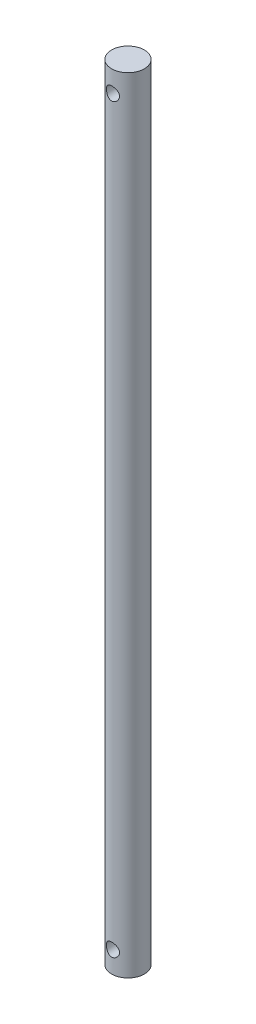
ISO-10303-21;
HEADER;
FILE_DESCRIPTION(('STEP AP214'),'2;1');
FILE_NAME('part.step','',(''),(''),'','','');
FILE_SCHEMA(('AUTOMOTIVE_DESIGN { 1 0 10303 214 1 1 1 1 }'));
ENDSEC;
DATA;
#1=APPLICATION_CONTEXT('core data for automotive mechanical design processes');
#2=APPLICATION_PROTOCOL_DEFINITION('international standard','automotive_design',2000,#1);
#3=PRODUCT_CONTEXT('',#1,'mechanical');
#4=PRODUCT('Part','Part','',(#3));
#5=PRODUCT_RELATED_PRODUCT_CATEGORY('part','',(#4));
#6=PRODUCT_DEFINITION_FORMATION('','',#4);
#7=PRODUCT_DEFINITION_CONTEXT('part definition',#1,'design');
#8=PRODUCT_DEFINITION('design','',#6,#7);
#9=PRODUCT_DEFINITION_SHAPE('','',#8);
#10=(LENGTH_UNIT() NAMED_UNIT(*) SI_UNIT(.MILLI.,.METRE.));
#11=(NAMED_UNIT(*) PLANE_ANGLE_UNIT() SI_UNIT($,.RADIAN.));
#12=(NAMED_UNIT(*) SI_UNIT($,.STERADIAN.) SOLID_ANGLE_UNIT());
#13=UNCERTAINTY_MEASURE_WITH_UNIT(LENGTH_MEASURE(1.E-05),#10,'distance_accuracy_value','');
#14=(GEOMETRIC_REPRESENTATION_CONTEXT(3) GLOBAL_UNCERTAINTY_ASSIGNED_CONTEXT((#13)) GLOBAL_UNIT_ASSIGNED_CONTEXT((#10,
#11,#12)) REPRESENTATION_CONTEXT('',''));
#15=CARTESIAN_POINT('',(0.,0.,0.));
#16=DIRECTION('',(0.,0.,1.));
#17=DIRECTION('',(1.,0.,0.));
#18=AXIS2_PLACEMENT_3D('',#15,#16,#17);
#19=CARTESIAN_POINT('',(0.,339.,0.));
#20=DIRECTION('',(0.,-1.,0.));
#21=DIRECTION('',(0.,0.,-1.));
#22=AXIS2_PLACEMENT_3D('',#19,#20,#21);
#23=CYLINDRICAL_SURFACE('',#22,5.);
#24=CARTESIAN_POINT('',(0.,0.,0.));
#25=DIRECTION('',(0.,1.,0.));
#26=DIRECTION('',(0.,0.,1.));
#27=AXIS2_PLACEMENT_3D('',#24,#25,#26);
#28=CIRCLE('',#27,5.);
#29=CARTESIAN_POINT('',(0.,0.,5.));
#30=VERTEX_POINT('',#29);
#31=EDGE_CURVE('E10',#30,#30,#28,.T.);
#32=ORIENTED_EDGE('',*,*,#31,.T.);
#33=EDGE_LOOP('',(#32));
#34=FACE_BOUND('',#33,.T.);
#35=CARTESIAN_POINT('',(0.,239.5,0.));
#36=DIRECTION('',(0.,1.,0.));
#37=DIRECTION('',(0.,0.,1.));
#38=AXIS2_PLACEMENT_3D('',#35,#36,#37);
#39=CIRCLE('',#38,5.);
#40=CARTESIAN_POINT('',(0.,239.5,5.));
#41=VERTEX_POINT('',#40);
#42=EDGE_CURVE('E58',#41,#41,#39,.T.);
#43=ORIENTED_EDGE('',*,*,#42,.F.);
#44=EDGE_LOOP('',(#43));
#45=FACE_BOUND('',#44,.T.);
#46=CARTESIAN_POINT('',(-2.,6.5,4.58257569495584));
#47=CARTESIAN_POINT('',(-1.99999540068022,6.39287631028704,4.58258022779737));
#48=CARTESIAN_POINT('',(-1.99134173553407,6.28557370566816,4.58638433797122));
#49=CARTESIAN_POINT('',(-1.95706710874823,6.07406091590043,4.601110833066));
#50=CARTESIAN_POINT('',(-1.93140279032341,5.96985934566148,4.61205140628347));
#51=CARTESIAN_POINT('',(-1.86423554476216,5.76794819102917,4.63960410719222));
#52=CARTESIAN_POINT('',(-1.82279228998551,5.67021575670878,4.65619484260882));
#53=CARTESIAN_POINT('',(-1.72542013194152,5.4831146451377,4.69314677188873));
#54=CARTESIAN_POINT('',(-1.66949439157707,5.39374414747589,4.71350714220611));
#55=CARTESIAN_POINT('',(-1.54132201423254,5.22073968545567,4.75700861562336));
#56=CARTESIAN_POINT('',(-1.46837936836551,5.13764360060276,4.78023917022606));
#57=CARTESIAN_POINT('',(-1.30970909513215,4.9844709791442,4.82612457915278));
#58=CARTESIAN_POINT('',(-1.22397701877347,4.9143989922903,4.84877922991761));
#59=CARTESIAN_POINT('',(-1.03800631337303,4.78659360969029,4.89203407641395));
#60=CARTESIAN_POINT('',(-0.937328966419093,4.72945570031406,4.9125180361257));
#61=CARTESIAN_POINT('',(-0.726825322068638,4.63315642982621,4.94803927702516));
#62=CARTESIAN_POINT('',(-0.617002769076882,4.59398775375113,4.96307877403249));
#63=CARTESIAN_POINT('',(-0.396966427039753,4.53665851400691,4.98538324990609));
#64=CARTESIAN_POINT('',(-0.287028984858316,4.51757268602978,4.99298936770628));
#65=CARTESIAN_POINT('',(-0.0652663285839612,4.49797151421855,5.00080310687431));
#66=CARTESIAN_POINT('',(0.0465581658394121,4.4974492440342,5.00101348770556));
#67=CARTESIAN_POINT('',(0.26223249470209,4.5144827698042,4.99421962820612));
#68=CARTESIAN_POINT('',(0.366177452870458,4.53102477275472,4.98761996771485));
#69=CARTESIAN_POINT('',(0.569673109221914,4.57999287630297,4.96849291469141));
#70=CARTESIAN_POINT('',(0.66922348439124,4.61242014239846,4.95596508721342));
#71=CARTESIAN_POINT('',(0.862897938510559,4.69263648287826,4.92596824457467));
#72=CARTESIAN_POINT('',(0.956917623378897,4.74064971481538,4.90842760466223));
#73=CARTESIAN_POINT('',(1.13580815074131,4.85046500691916,4.87014585180275));
#74=CARTESIAN_POINT('',(1.22067584271796,4.91227179310017,4.84940364267149));
#75=CARTESIAN_POINT('',(1.38476882799018,5.05264913594388,4.80521637176122));
#76=CARTESIAN_POINT('',(1.46325784526632,5.1320538925728,4.78168326511759));
#77=CARTESIAN_POINT('',(1.60610741539265,5.302990571832,4.73561660973263));
#78=CARTESIAN_POINT('',(1.67046334378698,5.39452644819561,4.71308339008076));
#79=CARTESIAN_POINT('',(1.78490418871927,5.59041902237394,4.67096897409023));
#80=CARTESIAN_POINT('',(1.83453465163626,5.69506483033865,4.65148914057708));
#81=CARTESIAN_POINT('',(1.91517625986646,5.91221549031222,4.61887590344084));
#82=CARTESIAN_POINT('',(1.94619949837798,6.02471518472659,4.60573837891311));
#83=CARTESIAN_POINT('',(1.9869549488549,6.24703577746744,4.58829759702716));
#84=CARTESIAN_POINT('',(1.99787209681454,6.35660044712856,4.58350366456138));
#85=CARTESIAN_POINT('',(2.00156132644289,6.57607720775956,4.58189497869038));
#86=CARTESIAN_POINT('',(1.99433891059128,6.68598918327566,4.58507780560362));
#87=CARTESIAN_POINT('',(1.96303289479003,6.89645893495694,4.59856044359114));
#88=CARTESIAN_POINT('',(1.93993306202386,6.99719293740006,4.60844457798301));
#89=CARTESIAN_POINT('',(1.87880418691087,7.19328840478545,4.6337005102734));
#90=CARTESIAN_POINT('',(1.84077183430228,7.28864867310715,4.64907352488598));
#91=CARTESIAN_POINT('',(1.74913563948157,7.47560235779566,4.68433781860101));
#92=CARTESIAN_POINT('',(1.69496286826465,7.56688618869453,4.70438704639177));
#93=CARTESIAN_POINT('',(1.57316522444182,7.73948298744159,4.74650385157795));
#94=CARTESIAN_POINT('',(1.50553487348189,7.82079187279545,4.76857224896045));
#95=CARTESIAN_POINT('',(1.35284421168058,7.97737340859937,4.81420915971416));
#96=CARTESIAN_POINT('',(1.26686542944543,8.0517565652916,4.83776807285233));
#97=CARTESIAN_POINT('',(1.0830836333685,8.18517707660977,4.88219794567532));
#98=CARTESIAN_POINT('',(0.985280138466608,8.24421380659512,4.90306879593136));
#99=CARTESIAN_POINT('',(0.780279934003014,8.34504762646334,4.9398371590039));
#100=CARTESIAN_POINT('',(0.673085480998744,8.38684884417366,4.9557358624066));
#101=CARTESIAN_POINT('',(0.452393590914547,8.45154885239976,4.98072713468904));
#102=CARTESIAN_POINT('',(0.338899610276818,8.47445790141069,4.98982339706103));
#103=CARTESIAN_POINT('',(0.116816510362613,8.49950470165284,4.99979008211858));
#104=CARTESIAN_POINT('',(0.00839049265208496,8.50290012856203,5.00115846749745));
#105=CARTESIAN_POINT('',(-0.207433835792267,8.49214452061653,4.99686042373721));
#106=CARTESIAN_POINT('',(-0.314832299614388,8.47799614184442,4.99119505948774));
#107=CARTESIAN_POINT('',(-0.522170901733398,8.43345321200012,4.97371513381836));
#108=CARTESIAN_POINT('',(-0.622238803864868,8.40357105524344,4.96209480698998));
#109=CARTESIAN_POINT('',(-0.815922355542603,8.32894719411893,4.93394947767358));
#110=CARTESIAN_POINT('',(-0.909536811189122,8.28420274906091,4.91742357062859));
#111=CARTESIAN_POINT('',(-1.09220303880515,8.17889680664677,4.88018094611867));
#112=CARTESIAN_POINT('',(-1.18087037518738,8.11772372467487,4.859311306872));
#113=CARTESIAN_POINT('',(-1.34705404014793,7.98221146125301,4.8158940222708));
#114=CARTESIAN_POINT('',(-1.42456572919735,7.90786683039178,4.79334568464253));
#115=CARTESIAN_POINT('',(-1.57120121894449,7.74268485315134,4.7473776736768));
#116=CARTESIAN_POINT('',(-1.63950871002775,7.6511114248559,4.72399047228096));
#117=CARTESIAN_POINT('',(-1.75984762763149,7.45705756427917,4.68049656850749));
#118=CARTESIAN_POINT('',(-1.81187714055767,7.35457585154645,4.66039025195448));
#119=CARTESIAN_POINT('',(-1.89399048451634,7.1509638135298,4.62758914239063));
#120=CARTESIAN_POINT('',(-1.92562535665267,7.05053839728756,4.61439096680415));
#121=CARTESIAN_POINT('',(-1.97271990928489,6.84551095850736,4.5944582603412));
#122=CARTESIAN_POINT('',(-1.98822466191608,6.74092142657564,4.58770572290435));
#123=CARTESIAN_POINT('',(-1.99692202185513,6.61322176088848,4.5839176394209));
#124=CARTESIAN_POINT('',(-1.99807530751895,6.59059851964357,4.58341531117284));
#125=CARTESIAN_POINT('',(-1.9996148112425,6.54531952320278,4.58274384722723));
#126=CARTESIAN_POINT('',(-2.0000009730612,6.52266376574484,4.5825747359592));
#127=CARTESIAN_POINT('',(-2.,6.5,4.58257569495584));
#128=B_SPLINE_CURVE_WITH_KNOTS('',3,(#46,#47,#48,#49,#50,#51,#52,#53,#54,#55,#56,#57,#58,#59,
#60,#61,#62,#63,#64,#65,#66,#67,#68,#69,#70,#71,#72,#73,#74,#75,#76,#77,#78,#79,#80,#81,#82,#83,
#84,#85,#86,#87,#88,#89,#90,#91,#92,#93,#94,#95,#96,#97,#98,#99,#100,#101,#102,#103,#104,#105,
#106,#107,#108,#109,#110,#111,#112,#113,#114,#115,#116,#117,#118,#119,#120,#121,#122,#123,#124,
#125,#126,#127),.UNSPECIFIED.,.T.,.F.,(4,2,2,2,2,2,2,2,2,2,2,2,2,2,2,2,2,2,2,2,2,2,2,2,2,2,2,2,
2,2,2,2,2,2,2,2,2,2,2,2,4),(0.,0.321277648767654,0.643377335822245,0.96427082329339,
1.28509428823861,1.62255618284425,1.96013574348342,2.31102669091428,2.6617746696948,
2.99554182887183,3.32918445305672,3.64408644830302,3.95901155129059,4.27868300234898,
4.59846414940031,4.93924044081356,5.28012807127127,5.63064458717257,5.98093304800101,
6.3098214752442,6.63861014907939,6.94867248085145,7.25880358651638,7.58151154652701,
7.90435114525849,8.25103734246979,8.59773764852748,8.94435487312812,9.29078375954136,
9.61461039755953,9.93838801512601,10.2522199444335,10.5661097782858,10.8938705113992,
11.2217671656421,11.5699625328561,11.9181988175919,12.2351666081908,12.5512463021924,
12.619212852096,12.6871843847255),.UNSPECIFIED.);
#129=CARTESIAN_POINT('',(-2.,6.5,4.58257569495584));
#130=VERTEX_POINT('',#129);
#131=EDGE_CURVE('E67',#130,#130,#128,.T.);
#132=ORIENTED_EDGE('',*,*,#131,.F.);
#133=EDGE_LOOP('',(#132));
#134=FACE_BOUND('',#133,.T.);
#135=CARTESIAN_POINT('',(0.,8.50000000000001,-5.));
#136=CARTESIAN_POINT('',(0.107493005442891,8.49999014817629,-4.99999271227085));
#137=CARTESIAN_POINT('',(0.215172564090672,8.49128224791163,-4.99649294306933));
#138=CARTESIAN_POINT('',(0.427496480417894,8.45675229647876,-4.98283453100642));
#139=CARTESIAN_POINT('',(0.532131777561247,8.43088372091387,-4.97265778698877));
#140=CARTESIAN_POINT('',(0.734953922727403,8.36312392194117,-4.94674209213118));
#141=CARTESIAN_POINT('',(0.83316066161696,8.32128515378327,-4.93102136364072));
#142=CARTESIAN_POINT('',(1.02107197032837,8.22298082667345,-4.89556610796078));
#143=CARTESIAN_POINT('',(1.11077947675099,8.16652034508107,-4.87583297458057));
#144=CARTESIAN_POINT('',(1.28350100757039,8.03776450143906,-4.83330886170419));
#145=CARTESIAN_POINT('',(1.36606227255021,7.96489334375973,-4.8104229692919));
#146=CARTESIAN_POINT('',(1.51817500478472,7.80659999652322,-4.76460576906194));
#147=CARTESIAN_POINT('',(1.58772010713353,7.72117170278826,-4.74167444453792));
#148=CARTESIAN_POINT('',(1.71487456729288,7.53557192975773,-4.69722791797136));
#149=CARTESIAN_POINT('',(1.77181498119547,7.4349135139768,-4.67582115964951));
#150=CARTESIAN_POINT('',(1.86775471903715,7.22446360157996,-4.63833647186793));
#151=CARTESIAN_POINT('',(1.90676256428583,7.11467647215164,-4.62225601244176));
#152=CARTESIAN_POINT('',(1.96389882339587,6.8942876664079,-4.59826357660818));
#153=CARTESIAN_POINT('',(1.98289396580565,6.78394876442379,-4.59001420355605));
#154=CARTESIAN_POINT('',(2.00217296164003,6.56136500169273,-4.58164004049144));
#155=CARTESIAN_POINT('',(2.00246601631322,6.44912110537499,-4.58151125522768));
#156=CARTESIAN_POINT('',(1.98498936750454,6.23424332854196,-4.58910500279994));
#157=CARTESIAN_POINT('',(1.96847531430514,6.13148428559097,-4.5962817503845));
#158=CARTESIAN_POINT('',(1.91994688029782,5.93034044399329,-4.61676187607836));
#159=CARTESIAN_POINT('',(1.88792979480463,5.83195641188969,-4.63006632321673));
#160=CARTESIAN_POINT('',(1.80869473255107,5.63998216380396,-4.6615948508853));
#161=CARTESIAN_POINT('',(1.76117986231532,5.54653076094531,-4.67991379280788));
#162=CARTESIAN_POINT('',(1.65250646073221,5.36858418363844,-4.7193811638989));
#163=CARTESIAN_POINT('',(1.59134280510084,5.28409239059719,-4.74053065456848));
#164=CARTESIAN_POINT('',(1.45155059945443,5.119590271198,-4.78526736742271));
#165=CARTESIAN_POINT('',(1.37193746297063,5.04043127055398,-4.80891664976152));
#166=CARTESIAN_POINT('',(1.20031442743019,4.89631552199796,-4.85459824958282));
#167=CARTESIAN_POINT('',(1.10830206533443,4.83136160258971,-4.87663024445325));
#168=CARTESIAN_POINT('',(0.912077652605843,4.71638255258417,-4.91714681264548));
#169=CARTESIAN_POINT('',(0.807660491346477,4.66667771880295,-4.93555270095415));
#170=CARTESIAN_POINT('',(0.591023765482882,4.58583213892194,-4.96614828328759));
#171=CARTESIAN_POINT('',(0.478808196849674,4.55468196244259,-4.97834113462382));
#172=CARTESIAN_POINT('',(0.25689588760782,4.5135517045803,-4.99456139506911));
#173=CARTESIAN_POINT('',(0.147443293985534,4.50242754574644,-4.99902945833514));
#174=CARTESIAN_POINT('',(-0.0718453098078174,4.49828689947139,-5.00068478510631));
#175=CARTESIAN_POINT('',(-0.181681213223924,4.50526571845249,-4.99787393582291));
#176=CARTESIAN_POINT('',(-0.393432739121988,4.53629175255199,-4.98557567063753));
#177=CARTESIAN_POINT('',(-0.495482491775474,4.55955798035098,-4.97639391345523));
#178=CARTESIAN_POINT('',(-0.69413542806078,4.62143570830981,-4.952594414055));
#179=CARTESIAN_POINT('',(-0.790737910224845,4.66004917966868,-4.9379759735653));
#180=CARTESIAN_POINT('',(-0.979078785816702,4.75278493967995,-4.90416594770812));
#181=CARTESIAN_POINT('',(-1.07057802275541,4.80734547204315,-4.88484815979804));
#182=CARTESIAN_POINT('',(-1.24344359124656,4.92994032390564,-4.84373364745525));
#183=CARTESIAN_POINT('',(-1.32480584076113,4.99798004292261,-4.8219359311027));
#184=CARTESIAN_POINT('',(-1.48072304302882,5.15087001294963,-4.77645117638112));
#185=CARTESIAN_POINT('',(-1.55447393380606,5.23653354150621,-4.75273441425052));
#186=CARTESIAN_POINT('',(-1.68675119741371,5.41944008300937,-4.70741672917132));
#187=CARTESIAN_POINT('',(-1.74527506133751,5.51668500033995,-4.68581615526511));
#188=CARTESIAN_POINT('',(-1.84580750193163,5.72146169459411,-4.64714299907709));
#189=CARTESIAN_POINT('',(-1.88765059453445,5.82908399921231,-4.63011630884788));
#190=CARTESIAN_POINT('',(-1.9522962197053,6.05073365171516,-4.60323673477932));
#191=CARTESIAN_POINT('',(-1.97511280526932,6.16475620581243,-4.59337855695998));
#192=CARTESIAN_POINT('',(-1.9997156172784,6.38712790177454,-4.58271759299926));
#193=CARTESIAN_POINT('',(-2.00289708230287,6.49529483959335,-4.58131421008171));
#194=CARTESIAN_POINT('',(-1.99180315927752,6.71054485771329,-4.58614836033098));
#195=CARTESIAN_POINT('',(-1.97752998791378,6.81762807390258,-4.59238492324793));
#196=CARTESIAN_POINT('',(-1.93307136615365,7.02333218985504,-4.61126649079021));
#197=CARTESIAN_POINT('',(-1.90353749357098,7.122120274433,-4.62364831827449));
#198=CARTESIAN_POINT('',(-1.83000544849101,7.31337862961348,-4.65324001232697));
#199=CARTESIAN_POINT('',(-1.78600328139381,7.40584714689983,-4.67045121206007));
#200=CARTESIAN_POINT('',(-1.68187276275973,7.58760961927078,-4.70898609604491));
#201=CARTESIAN_POINT('',(-1.62096533515949,7.67641867013048,-4.73048882313242));
#202=CARTESIAN_POINT('',(-1.48589211927149,7.84299331720376,-4.77463804372237));
#203=CARTESIAN_POINT('',(-1.41172233481812,7.92075557212832,-4.79728488048406));
#204=CARTESIAN_POINT('',(-1.24650550627246,8.06820285326361,-4.84293567087394));
#205=CARTESIAN_POINT('',(-1.15467600114614,8.13703730689807,-4.86586757962185));
#206=CARTESIAN_POINT('',(-0.959900320285779,8.25833704262164,-4.90800406713717));
#207=CARTESIAN_POINT('',(-0.856949004547237,8.31079471215253,-4.92720691092906));
#208=CARTESIAN_POINT('',(-0.644738062495202,8.39662221519029,-4.95939714815861));
#209=CARTESIAN_POINT('',(-0.535631618219695,8.43032932356034,-4.97249363055028));
#210=CARTESIAN_POINT('',(-0.31287654628122,8.47863912095426,-4.99144306209366));
#211=CARTESIAN_POINT('',(-0.199243525858911,8.49330243674389,-4.99731899495638));
#212=CARTESIAN_POINT('',(-0.0569122978909286,8.49939538097827,-4.99975899504136));
#213=CARTESIAN_POINT('',(-0.0284626887407579,8.5000026086292,-5.00000192969176));
#214=CARTESIAN_POINT('',(0.,8.50000000000001,-5.));
#215=B_SPLINE_CURVE_WITH_KNOTS('',3,(#135,#136,#137,#138,#139,#140,#141,#142,#143,#144,#145,
#146,#147,#148,#149,#150,#151,#152,#153,#154,#155,#156,#157,#158,#159,#160,#161,#162,#163,#164,
#165,#166,#167,#168,#169,#170,#171,#172,#173,#174,#175,#176,#177,#178,#179,#180,#181,#182,#183,
#184,#185,#186,#187,#188,#189,#190,#191,#192,#193,#194,#195,#196,#197,#198,#199,#200,#201,#202,
#203,#204,#205,#206,#207,#208,#209,#210,#211,#212,#213,#214),.UNSPECIFIED.,.T.,.F.,(4,2,2,2,2,2,
2,2,2,2,2,2,2,2,2,2,2,2,2,2,2,2,2,2,2,2,2,2,2,2,2,2,2,2,2,2,2,2,2,4),(0.,0.322402987893069,
0.645683636007935,0.967911457471583,1.29002753567984,1.62597381700397,1.96208394934411,
2.31315258819217,2.66405423118268,2.99904105308829,3.33386306340488,3.64538328401372,
3.95695787256047,4.27489126298816,4.59294421938183,4.93558349186557,5.27829092839733,
5.62776913162806,5.9770695611379,6.30569184528007,6.63422893570082,6.94800455564365,
7.26182048993796,7.58523513398263,7.90877959498969,8.25368474624414,8.59864669043748,
8.94695045140828,9.29499672645934,9.61799673392748,9.94095572563046,10.2511431854877,
10.5614163580516,10.8894546805669,11.2175920134839,11.5670042353384,11.9165786364053,
12.2596430101332,12.6016125240434,12.686980458968),.UNSPECIFIED.);
#216=CARTESIAN_POINT('',(0.,8.50000000000001,-5.));
#217=VERTEX_POINT('',#216);
#218=EDGE_CURVE('E64',#217,#217,#215,.T.);
#219=ORIENTED_EDGE('',*,*,#218,.F.);
#220=EDGE_LOOP('',(#219));
#221=FACE_BOUND('',#220,.T.);
#222=CARTESIAN_POINT('',(-2.,233.,4.58257569495584));
#223=CARTESIAN_POINT('',(-1.99999540068022,232.892876310287,4.58258022779737));
#224=CARTESIAN_POINT('',(-1.99134173553407,232.785573705668,4.58638433797122));
#225=CARTESIAN_POINT('',(-1.95706710874823,232.5740609159,4.601110833066));
#226=CARTESIAN_POINT('',(-1.9314027903234,232.469859345662,4.61205140628347));
#227=CARTESIAN_POINT('',(-1.86423554476216,232.267948191029,4.63960410719222));
#228=CARTESIAN_POINT('',(-1.82279228998552,232.170215756709,4.65619484260882));
#229=CARTESIAN_POINT('',(-1.72542013194153,231.983114645138,4.69314677188873));
#230=CARTESIAN_POINT('',(-1.66949439157708,231.893744147476,4.71350714220611));
#231=CARTESIAN_POINT('',(-1.54132201423256,231.720739685456,4.75700861562335));
#232=CARTESIAN_POINT('',(-1.46837936836554,231.637643600603,4.78023917022605));
#233=CARTESIAN_POINT('',(-1.30970909513219,231.484470979144,4.82612457915276));
#234=CARTESIAN_POINT('',(-1.2239770187735,231.41439899229,4.84877922991761));
#235=CARTESIAN_POINT('',(-1.03800631337305,231.28659360969,4.89203407641394));
#236=CARTESIAN_POINT('',(-0.937328966419111,231.229455700314,4.9125180361257));
#237=CARTESIAN_POINT('',(-0.72682532206865,231.133156429826,4.94803927702516));
#238=CARTESIAN_POINT('',(-0.617002769076889,231.093987753751,4.96307877403249));
#239=CARTESIAN_POINT('',(-0.396966427039751,231.036658514007,4.98538324990609));
#240=CARTESIAN_POINT('',(-0.287028984858313,231.01757268603,4.99298936770628));
#241=CARTESIAN_POINT('',(-0.06526632858396,230.997971514219,5.00080310687431));
#242=CARTESIAN_POINT('',(0.0465581658394105,230.997449244034,5.00101348770556));
#243=CARTESIAN_POINT('',(0.262232494702089,231.014482769804,4.99421962820612));
#244=CARTESIAN_POINT('',(0.36617745287046,231.031024772755,4.98761996771485));
#245=CARTESIAN_POINT('',(0.569673109221916,231.079992876303,4.96849291469141));
#246=CARTESIAN_POINT('',(0.669223484391237,231.112420142399,4.95596508721342));
#247=CARTESIAN_POINT('',(0.862897938510562,231.192636482878,4.92596824457467));
#248=CARTESIAN_POINT('',(0.956917623378909,231.240649714815,4.90842760466223));
#249=CARTESIAN_POINT('',(1.13580815074132,231.350465006919,4.87014585180274));
#250=CARTESIAN_POINT('',(1.22067584271797,231.4122717931,4.84940364267149));
#251=CARTESIAN_POINT('',(1.38476882799018,231.552649135944,4.80521637176122));
#252=CARTESIAN_POINT('',(1.46325784526633,231.632053892573,4.78168326511758));
#253=CARTESIAN_POINT('',(1.60610741539267,231.802990571832,4.73561660973262));
#254=CARTESIAN_POINT('',(1.67046334378699,231.894526448196,4.71308339008076));
#255=CARTESIAN_POINT('',(1.78490418871927,232.090419022374,4.67096897409023));
#256=CARTESIAN_POINT('',(1.83453465163626,232.195064830339,4.65148914057708));
#257=CARTESIAN_POINT('',(1.91517625986646,232.412215490312,4.61887590344084));
#258=CARTESIAN_POINT('',(1.94619949837799,232.524715184727,4.60573837891311));
#259=CARTESIAN_POINT('',(1.9869549488549,232.747035777467,4.58829759702716));
#260=CARTESIAN_POINT('',(1.99787209681454,232.856600447129,4.58350366456138));
#261=CARTESIAN_POINT('',(2.00156132644289,233.07607720776,4.58189497869038));
#262=CARTESIAN_POINT('',(1.99433891059129,233.185989183276,4.58507780560362));
#263=CARTESIAN_POINT('',(1.96303289479003,233.396458934957,4.59856044359114));
#264=CARTESIAN_POINT('',(1.93993306202386,233.4971929374,4.60844457798302));
#265=CARTESIAN_POINT('',(1.87880418691086,233.693288404786,4.6337005102734));
#266=CARTESIAN_POINT('',(1.84077183430227,233.788648673107,4.64907352488598));
#267=CARTESIAN_POINT('',(1.74913563948157,233.975602357796,4.68433781860102));
#268=CARTESIAN_POINT('',(1.69496286826464,234.066886188695,4.70438704639177));
#269=CARTESIAN_POINT('',(1.57316522444182,234.239482987442,4.74650385157795));
#270=CARTESIAN_POINT('',(1.50553487348189,234.320791872795,4.76857224896045));
#271=CARTESIAN_POINT('',(1.35284421168058,234.477373408599,4.81420915971416));
#272=CARTESIAN_POINT('',(1.26686542944545,234.551756565292,4.83776807285233));
#273=CARTESIAN_POINT('',(1.08308363336852,234.68517707661,4.88219794567532));
#274=CARTESIAN_POINT('',(0.98528013846662,234.744213806595,4.90306879593135));
#275=CARTESIAN_POINT('',(0.780279934003017,234.845047626463,4.9398371590039));
#276=CARTESIAN_POINT('',(0.673085480998743,234.886848844174,4.9557358624066));
#277=CARTESIAN_POINT('',(0.452393590914542,234.9515488524,4.98072713468904));
#278=CARTESIAN_POINT('',(0.338899610276814,234.974457901411,4.98982339706103));
#279=CARTESIAN_POINT('',(0.116816510362611,234.999504701653,4.99979008211858));
#280=CARTESIAN_POINT('',(0.00839049265208351,235.002900128562,5.00115846749745));
#281=CARTESIAN_POINT('',(-0.207433835792269,234.992144520617,4.99686042373721));
#282=CARTESIAN_POINT('',(-0.314832299614391,234.977996141844,4.99119505948774));
#283=CARTESIAN_POINT('',(-0.522170901733402,234.933453212,4.97371513381836));
#284=CARTESIAN_POINT('',(-0.622238803864873,234.903571055243,4.96209480698998));
#285=CARTESIAN_POINT('',(-0.815922355542607,234.828947194119,4.93394947767358));
#286=CARTESIAN_POINT('',(-0.909536811189125,234.784202749061,4.91742357062859));
#287=CARTESIAN_POINT('',(-1.09220303880515,234.678896806647,4.88018094611867));
#288=CARTESIAN_POINT('',(-1.18087037518738,234.617723724675,4.859311306872));
#289=CARTESIAN_POINT('',(-1.34705404014792,234.482211461253,4.8158940222708));
#290=CARTESIAN_POINT('',(-1.42456572919734,234.407866830392,4.79334568464253));
#291=CARTESIAN_POINT('',(-1.57120121894448,234.242684853151,4.7473776736768));
#292=CARTESIAN_POINT('',(-1.63950871002774,234.151111424856,4.72399047228096));
#293=CARTESIAN_POINT('',(-1.75984762763149,233.957057564279,4.6804965685075));
#294=CARTESIAN_POINT('',(-1.81187714055767,233.854575851547,4.66039025195448));
#295=CARTESIAN_POINT('',(-1.89399048451633,233.65096381353,4.62758914239064));
#296=CARTESIAN_POINT('',(-1.92562535665266,233.550538397288,4.61439096680415));
#297=CARTESIAN_POINT('',(-1.97271990928489,233.345510958507,4.5944582603412));
#298=CARTESIAN_POINT('',(-1.98822466191607,233.240921426576,4.58770572290435));
#299=CARTESIAN_POINT('',(-1.99692202185513,233.113221760889,4.5839176394209));
#300=CARTESIAN_POINT('',(-1.99807530751895,233.090598519644,4.58341531117284));
#301=CARTESIAN_POINT('',(-1.9996148112425,233.045319523203,4.58274384722723));
#302=CARTESIAN_POINT('',(-2.0000009730612,233.022663765745,4.5825747359592));
#303=CARTESIAN_POINT('',(-2.,233.,4.58257569495584));
#304=B_SPLINE_CURVE_WITH_KNOTS('',3,(#222,#223,#224,#225,#226,#227,#228,#229,#230,#231,#232,
#233,#234,#235,#236,#237,#238,#239,#240,#241,#242,#243,#244,#245,#246,#247,#248,#249,#250,#251,
#252,#253,#254,#255,#256,#257,#258,#259,#260,#261,#262,#263,#264,#265,#266,#267,#268,#269,#270,
#271,#272,#273,#274,#275,#276,#277,#278,#279,#280,#281,#282,#283,#284,#285,#286,#287,#288,#289,
#290,#291,#292,#293,#294,#295,#296,#297,#298,#299,#300,#301,#302,#303),.UNSPECIFIED.,.T.,.F.,(4,
2,2,2,2,2,2,2,2,2,2,2,2,2,2,2,2,2,2,2,2,2,2,2,2,2,2,2,2,2,2,2,2,2,2,2,2,2,2,2,4),(0.,
0.321277648767675,0.643377335822242,0.964270823293383,1.28509428823857,1.62255618284419,
1.96013574348339,2.31102669091426,2.66177466969481,2.99554182887184,3.32918445305672,
3.64408644830302,3.9590115512906,4.27868300234899,4.59846414940032,4.93924044081357,
5.28012807127129,5.63064458717255,5.98093304800102,6.30982147524419,6.63861014907939,
6.94867248085145,7.25880358651642,7.58151154652703,7.90435114525848,8.25103734246979,
8.59773764852747,8.94435487312813,9.29078375954137,9.61461039755953,9.93838801512602,
10.2522199444335,10.5661097782859,10.8938705113992,11.2217671656421,11.5699625328561,
11.9181988175919,12.2351666081907,12.5512463021924,12.619212852096,12.6871843847255),.UNSPECIFIED.);
#305=CARTESIAN_POINT('',(-2.,233.,4.58257569495584));
#306=VERTEX_POINT('',#305);
#307=EDGE_CURVE('E109',#306,#306,#304,.T.);
#308=ORIENTED_EDGE('',*,*,#307,.F.);
#309=EDGE_LOOP('',(#308));
#310=FACE_BOUND('',#309,.T.);
#311=CARTESIAN_POINT('',(0.,235.,-5.));
#312=CARTESIAN_POINT('',(0.107493005442892,234.999990148176,-4.99999271227084));
#313=CARTESIAN_POINT('',(0.215172564090676,234.991282247912,-4.99649294306933));
#314=CARTESIAN_POINT('',(0.427496480417898,234.956752296479,-4.98283453100642));
#315=CARTESIAN_POINT('',(0.532131777561248,234.930883720914,-4.97265778698877));
#316=CARTESIAN_POINT('',(0.734953922727405,234.863123921941,-4.94674209213118));
#317=CARTESIAN_POINT('',(0.833160661616964,234.821285153783,-4.93102136364072));
#318=CARTESIAN_POINT('',(1.02107197032837,234.722980826674,-4.89556610796078));
#319=CARTESIAN_POINT('',(1.11077947675099,234.666520345081,-4.87583297458057));
#320=CARTESIAN_POINT('',(1.28350100757039,234.537764501439,-4.83330886170419));
#321=CARTESIAN_POINT('',(1.36606227255021,234.46489334376,-4.81042296929191));
#322=CARTESIAN_POINT('',(1.51817500478472,234.306599996523,-4.76460576906195));
#323=CARTESIAN_POINT('',(1.58772010713353,234.221171702788,-4.74167444453792));
#324=CARTESIAN_POINT('',(1.71487456729288,234.035571929758,-4.69722791797136));
#325=CARTESIAN_POINT('',(1.77181498119547,233.934913513977,-4.67582115964951));
#326=CARTESIAN_POINT('',(1.86775471903715,233.72446360158,-4.63833647186793));
#327=CARTESIAN_POINT('',(1.90676256428584,233.614676472152,-4.62225601244176));
#328=CARTESIAN_POINT('',(1.96389882339587,233.394287666408,-4.59826357660818));
#329=CARTESIAN_POINT('',(1.98289396580565,233.283948764424,-4.59001420355605));
#330=CARTESIAN_POINT('',(2.00217296164003,233.061365001693,-4.58164004049144));
#331=CARTESIAN_POINT('',(2.00246601631322,232.949121105375,-4.58151125522768));
#332=CARTESIAN_POINT('',(1.98498936750455,232.734243328542,-4.58910500279994));
#333=CARTESIAN_POINT('',(1.96847531430514,232.631484285591,-4.5962817503845));
#334=CARTESIAN_POINT('',(1.91994688029783,232.430340443993,-4.61676187607836));
#335=CARTESIAN_POINT('',(1.88792979480464,232.33195641189,-4.63006632321672));
#336=CARTESIAN_POINT('',(1.80869473255108,232.139982163804,-4.6615948508853));
#337=CARTESIAN_POINT('',(1.76117986231532,232.046530760945,-4.67991379280787));
#338=CARTESIAN_POINT('',(1.65250646073222,231.868584183638,-4.7193811638989));
#339=CARTESIAN_POINT('',(1.59134280510085,231.784092390597,-4.74053065456848));
#340=CARTESIAN_POINT('',(1.45155059945445,231.619590271198,-4.7852673674227));
#341=CARTESIAN_POINT('',(1.37193746297066,231.540431270554,-4.80891664976151));
#342=CARTESIAN_POINT('',(1.20031442743022,231.396315521998,-4.85459824958281));
#343=CARTESIAN_POINT('',(1.10830206533446,231.33136160259,-4.87663024445324));
#344=CARTESIAN_POINT('',(0.912077652605859,231.216382552584,-4.91714681264548));
#345=CARTESIAN_POINT('',(0.807660491346491,231.166677718803,-4.93555270095414));
#346=CARTESIAN_POINT('',(0.59102376548289,231.085832138922,-4.96614828328759));
#347=CARTESIAN_POINT('',(0.478808196849679,231.054681962443,-4.97834113462382));
#348=CARTESIAN_POINT('',(0.256895887607823,231.01355170458,-4.99456139506911));
#349=CARTESIAN_POINT('',(0.147443293985537,231.002427545746,-4.99902945833514));
#350=CARTESIAN_POINT('',(-0.071845309807814,230.998286899471,-5.00068478510631));
#351=CARTESIAN_POINT('',(-0.18168121322392,231.005265718453,-4.99787393582292));
#352=CARTESIAN_POINT('',(-0.393432739121985,231.036291752552,-4.98557567063753));
#353=CARTESIAN_POINT('',(-0.495482491775472,231.059557980351,-4.97639391345523));
#354=CARTESIAN_POINT('',(-0.694135428060779,231.12143570831,-4.952594414055));
#355=CARTESIAN_POINT('',(-0.790737910224843,231.160049179669,-4.9379759735653));
#356=CARTESIAN_POINT('',(-0.979078785816698,231.25278493968,-4.90416594770812));
#357=CARTESIAN_POINT('',(-1.0705780227554,231.307345472043,-4.88484815979804));
#358=CARTESIAN_POINT('',(-1.24344359124655,231.429940323906,-4.84373364745525));
#359=CARTESIAN_POINT('',(-1.32480584076113,231.497980042923,-4.8219359311027));
#360=CARTESIAN_POINT('',(-1.48072304302883,231.65087001295,-4.77645117638111));
#361=CARTESIAN_POINT('',(-1.55447393380608,231.736533541506,-4.75273441425051));
#362=CARTESIAN_POINT('',(-1.68675119741372,231.919440083009,-4.70741672917132));
#363=CARTESIAN_POINT('',(-1.74527506133752,232.01668500034,-4.68581615526511));
#364=CARTESIAN_POINT('',(-1.84580750193163,232.221461694594,-4.64714299907708));
#365=CARTESIAN_POINT('',(-1.88765059453446,232.329083999212,-4.63011630884788));
#366=CARTESIAN_POINT('',(-1.95229621970531,232.550733651715,-4.60323673477931));
#367=CARTESIAN_POINT('',(-1.97511280526931,232.664756205812,-4.59337855695998));
#368=CARTESIAN_POINT('',(-1.9997156172784,232.887127901775,-4.58271759299926));
#369=CARTESIAN_POINT('',(-2.00289708230287,232.995294839593,-4.58131421008171));
#370=CARTESIAN_POINT('',(-1.99180315927752,233.210544857713,-4.58614836033098));
#371=CARTESIAN_POINT('',(-1.97752998791378,233.317628073903,-4.59238492324793));
#372=CARTESIAN_POINT('',(-1.93307136615365,233.523332189855,-4.61126649079021));
#373=CARTESIAN_POINT('',(-1.90353749357098,233.622120274433,-4.62364831827449));
#374=CARTESIAN_POINT('',(-1.83000544849102,233.813378629614,-4.65324001232696));
#375=CARTESIAN_POINT('',(-1.78600328139382,233.9058471469,-4.67045121206006));
#376=CARTESIAN_POINT('',(-1.68187276275974,234.087609619271,-4.70898609604491));
#377=CARTESIAN_POINT('',(-1.62096533515949,234.176418670131,-4.73048882313242));
#378=CARTESIAN_POINT('',(-1.4858921192715,234.342993317204,-4.77463804372237));
#379=CARTESIAN_POINT('',(-1.41172233481813,234.420755572128,-4.79728488048406));
#380=CARTESIAN_POINT('',(-1.24650550627248,234.568202853264,-4.84293567087394));
#381=CARTESIAN_POINT('',(-1.15467600114614,234.637037306898,-4.86586757962185));
#382=CARTESIAN_POINT('',(-0.959900320285781,234.758337042622,-4.90800406713717));
#383=CARTESIAN_POINT('',(-0.856949004547243,234.810794712153,-4.92720691092906));
#384=CARTESIAN_POINT('',(-0.644738062495211,234.89662221519,-4.95939714815861));
#385=CARTESIAN_POINT('',(-0.535631618219704,234.93032932356,-4.97249363055028));
#386=CARTESIAN_POINT('',(-0.312876546281232,234.978639120954,-4.99144306209366));
#387=CARTESIAN_POINT('',(-0.199243525858928,234.993302436744,-4.99731899495638));
#388=CARTESIAN_POINT('',(-0.0569122978909419,234.999395380978,-4.99975899504136));
#389=CARTESIAN_POINT('',(-0.0284626887407645,235.000002608629,-5.00000192969176));
#390=CARTESIAN_POINT('',(0.,235.,-5.));
#391=B_SPLINE_CURVE_WITH_KNOTS('',3,(#311,#312,#313,#314,#315,#316,#317,#318,#319,#320,#321,
#322,#323,#324,#325,#326,#327,#328,#329,#330,#331,#332,#333,#334,#335,#336,#337,#338,#339,#340,
#341,#342,#343,#344,#345,#346,#347,#348,#349,#350,#351,#352,#353,#354,#355,#356,#357,#358,#359,
#360,#361,#362,#363,#364,#365,#366,#367,#368,#369,#370,#371,#372,#373,#374,#375,#376,#377,#378,
#379,#380,#381,#382,#383,#384,#385,#386,#387,#388,#389,#390),.UNSPECIFIED.,.T.,.F.,(4,2,2,2,2,2,
2,2,2,2,2,2,2,2,2,2,2,2,2,2,2,2,2,2,2,2,2,2,2,2,2,2,2,2,2,2,2,2,2,4),(0.,0.322402987893074,
0.645683636007934,0.967911457471592,1.29002753567984,1.62597381700398,1.9620839493441,
2.31315258819216,2.66405423118269,2.99904105308828,3.33386306340484,3.6453832840137,
3.95695787256047,4.27489126298814,4.59294421938182,4.93558349186555,5.2782909283973,
5.62776913162805,5.9770695611379,6.30569184528007,6.63422893570082,6.94800455564365,
7.26182048993796,7.58523513398262,7.90877959498969,8.25368474624418,8.5986466904375,
8.94695045140828,9.29499672645932,9.61799673392748,9.94095572563045,10.2511431854877,
10.5614163580516,10.8894546805669,11.2175920134839,11.5670042353383,11.9165786364053,
12.2596430101332,12.6016125240434,12.686980458968),.UNSPECIFIED.);
#392=CARTESIAN_POINT('',(0.,235.,-5.));
#393=VERTEX_POINT('',#392);
#394=EDGE_CURVE('E49',#393,#393,#391,.T.);
#395=ORIENTED_EDGE('',*,*,#394,.F.);
#396=EDGE_LOOP('',(#395));
#397=FACE_BOUND('',#396,.T.);
#398=ADVANCED_FACE('F45',(#34,#45,#134,#221,#310,#397),#23,.T.);
#399=CARTESIAN_POINT('',(0.,0.,0.));
#400=DIRECTION('',(0.,1.,0.));
#401=DIRECTION('',(0.,0.,1.));
#402=AXIS2_PLACEMENT_3D('',#399,#400,#401);
#403=PLANE('',#402);
#404=ORIENTED_EDGE('',*,*,#31,.F.);
#405=EDGE_LOOP('',(#404));
#406=FACE_BOUND('',#405,.T.);
#407=ADVANCED_FACE('F88',(#406),#403,.F.);
#408=CARTESIAN_POINT('',(0.,239.5,0.));
#409=DIRECTION('',(0.,1.,0.));
#410=DIRECTION('',(0.,0.,1.));
#411=AXIS2_PLACEMENT_3D('',#408,#409,#410);
#412=PLANE('',#411);
#413=ORIENTED_EDGE('',*,*,#42,.T.);
#414=EDGE_LOOP('',(#413));
#415=FACE_BOUND('',#414,.T.);
#416=ADVANCED_FACE('F83',(#415),#412,.T.);
#417=CARTESIAN_POINT('',(0.,6.5,10.));
#418=DIRECTION('',(0.,0.,-1.));
#419=DIRECTION('',(-1.,0.,0.));
#420=AXIS2_PLACEMENT_3D('',#417,#418,#419);
#421=CYLINDRICAL_SURFACE('',#420,2.);
#422=ORIENTED_EDGE('',*,*,#131,.T.);
#423=EDGE_LOOP('',(#422));
#424=FACE_BOUND('',#423,.T.);
#425=ORIENTED_EDGE('',*,*,#218,.T.);
#426=EDGE_LOOP('',(#425));
#427=FACE_BOUND('',#426,.T.);
#428=ADVANCED_FACE('F78',(#424,#427),#421,.F.);
#429=CARTESIAN_POINT('',(0.,233.,10.));
#430=DIRECTION('',(0.,0.,-1.));
#431=DIRECTION('',(-1.,0.,0.));
#432=AXIS2_PLACEMENT_3D('',#429,#430,#431);
#433=CYLINDRICAL_SURFACE('',#432,2.);
#434=ORIENTED_EDGE('',*,*,#307,.T.);
#435=EDGE_LOOP('',(#434));
#436=FACE_BOUND('',#435,.T.);
#437=ORIENTED_EDGE('',*,*,#394,.T.);
#438=EDGE_LOOP('',(#437));
#439=FACE_BOUND('',#438,.T.);
#440=ADVANCED_FACE('F82',(#436,#439),#433,.F.);
#441=CLOSED_SHELL('',(#398,#407,#416,#428,#440));
#442=MANIFOLD_SOLID_BREP('B2',#441);
#443=ADVANCED_BREP_SHAPE_REPRESENTATION('',(#18,#442),#14);
#444=SHAPE_DEFINITION_REPRESENTATION(#9,#443);
ENDSEC;
END-ISO-10303-21;
